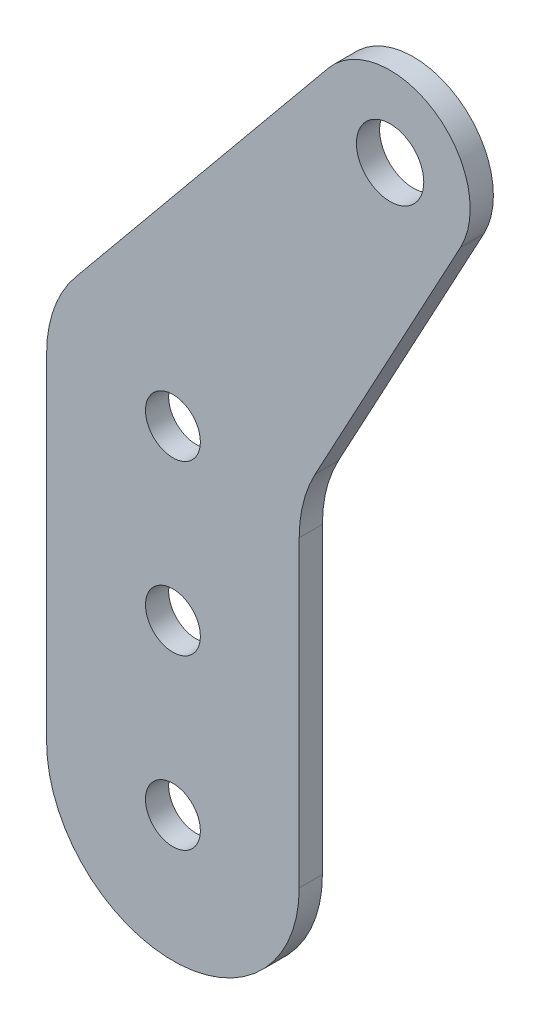
ISO-10303-21;
HEADER;
FILE_DESCRIPTION(('STEP AP214'),'2;1');
FILE_NAME('part.step','',(''),(''),'','','');
FILE_SCHEMA(('AUTOMOTIVE_DESIGN { 1 0 10303 214 1 1 1 1 }'));
ENDSEC;
DATA;
#1=APPLICATION_CONTEXT('core data for automotive mechanical design processes');
#2=APPLICATION_PROTOCOL_DEFINITION('international standard','automotive_design',2000,#1);
#3=PRODUCT_CONTEXT('',#1,'mechanical');
#4=PRODUCT('Part','Part','',(#3));
#5=PRODUCT_RELATED_PRODUCT_CATEGORY('part','',(#4));
#6=PRODUCT_DEFINITION_FORMATION('','',#4);
#7=PRODUCT_DEFINITION_CONTEXT('part definition',#1,'design');
#8=PRODUCT_DEFINITION('design','',#6,#7);
#9=PRODUCT_DEFINITION_SHAPE('','',#8);
#10=(LENGTH_UNIT() NAMED_UNIT(*) SI_UNIT(.MILLI.,.METRE.));
#11=(NAMED_UNIT(*) PLANE_ANGLE_UNIT() SI_UNIT($,.RADIAN.));
#12=(NAMED_UNIT(*) SI_UNIT($,.STERADIAN.) SOLID_ANGLE_UNIT());
#13=UNCERTAINTY_MEASURE_WITH_UNIT(LENGTH_MEASURE(1.E-05),#10,'distance_accuracy_value','');
#14=(GEOMETRIC_REPRESENTATION_CONTEXT(3) GLOBAL_UNCERTAINTY_ASSIGNED_CONTEXT((#13)) GLOBAL_UNIT_ASSIGNED_CONTEXT((#10,
#11,#12)) REPRESENTATION_CONTEXT('',''));
#15=CARTESIAN_POINT('',(0.,0.,0.));
#16=DIRECTION('',(0.,0.,1.));
#17=DIRECTION('',(1.,0.,0.));
#18=AXIS2_PLACEMENT_3D('',#15,#16,#17);
#19=CARTESIAN_POINT('',(16.38,50.8,0.875));
#20=DIRECTION('',(0.,0.,-1.));
#21=DIRECTION('',(-1.,0.,0.));
#22=AXIS2_PLACEMENT_3D('',#19,#20,#21);
#23=CYLINDRICAL_SURFACE('',#22,6.04);
#24=CARTESIAN_POINT('',(16.38,50.8,-0.875));
#25=DIRECTION('',(0.,0.,1.));
#26=DIRECTION('',(1.,0.,0.));
#27=AXIS2_PLACEMENT_3D('',#24,#25,#26);
#28=CIRCLE('',#27,6.04);
#29=CARTESIAN_POINT('',(21.6942958006757,47.929484341983,-0.875));
#30=VERTEX_POINT('',#29);
#31=CARTESIAN_POINT('',(11.7152723593544,54.636914911566,-0.875));
#32=VERTEX_POINT('',#31);
#33=EDGE_CURVE('E125',#30,#32,#28,.T.);
#34=ORIENTED_EDGE('',*,*,#33,.T.);
#35=DIRECTION('',(0.,0.,-1.));
#36=VECTOR('',#35,1.);
#37=CARTESIAN_POINT('',(11.7152723593544,54.636914911566,0.875));
#38=LINE('',#37,#36);
#39=CARTESIAN_POINT('',(11.7152723593544,54.636914911566,0.875));
#40=VERTEX_POINT('',#39);
#41=EDGE_CURVE('E123',#40,#32,#38,.T.);
#42=ORIENTED_EDGE('',*,*,#41,.F.);
#43=CARTESIAN_POINT('',(16.38,50.8,0.875));
#44=DIRECTION('',(0.,0.,1.));
#45=DIRECTION('',(1.,0.,0.));
#46=AXIS2_PLACEMENT_3D('',#43,#44,#45);
#47=CIRCLE('',#46,6.04);
#48=CARTESIAN_POINT('',(21.6942958006757,47.929484341983,0.875));
#49=VERTEX_POINT('',#48);
#50=EDGE_CURVE('E108',#49,#40,#47,.T.);
#51=ORIENTED_EDGE('',*,*,#50,.F.);
#52=DIRECTION('',(0.,0.,-1.));
#53=VECTOR('',#52,1.);
#54=CARTESIAN_POINT('',(21.6942958006757,47.929484341983,0.875));
#55=LINE('',#54,#53);
#56=EDGE_CURVE('E182',#49,#30,#55,.T.);
#57=ORIENTED_EDGE('',*,*,#56,.T.);
#58=EDGE_LOOP('',(#34,#42,#51,#57));
#59=FACE_BOUND('',#58,.T.);
#60=ADVANCED_FACE('F44',(#59),#23,.T.);
#61=CARTESIAN_POINT('',(-19.8176556724697,16.3007713246587,0.875));
#62=DIRECTION('',(-0.772305900769136,0.63525081317317,0.));
#63=DIRECTION('',(-0.63525081317317,-0.772305900769136,0.));
#64=AXIS2_PLACEMENT_3D('',#61,#62,#63);
#65=PLANE('',#64);
#66=DIRECTION('',(0.63525081317317,0.772305900769136,0.));
#67=VECTOR('',#66,1.);
#68=CARTESIAN_POINT('',(-19.8176556724697,16.3007713246587,-0.875));
#69=LINE('',#68,#67);
#70=CARTESIAN_POINT('',(-7.35621370482611,31.4507639954744,-0.875));
#71=VERTEX_POINT('',#70);
#72=EDGE_CURVE('E187',#71,#32,#69,.T.);
#73=ORIENTED_EDGE('',*,*,#72,.F.);
#74=DIRECTION('',(0.,0.,-1.));
#75=VECTOR('',#74,1.);
#76=CARTESIAN_POINT('',(-7.35621370482611,31.4507639954744,0.875));
#77=LINE('',#76,#75);
#78=CARTESIAN_POINT('',(-7.35621370482611,31.4507639954744,0.875));
#79=VERTEX_POINT('',#78);
#80=EDGE_CURVE('E130',#79,#71,#77,.T.);
#81=ORIENTED_EDGE('',*,*,#80,.F.);
#82=DIRECTION('',(0.63525081317317,0.772305900769136,0.));
#83=VECTOR('',#82,1.);
#84=CARTESIAN_POINT('',(-19.8176556724697,16.3007713246587,0.875));
#85=LINE('',#84,#83);
#86=EDGE_CURVE('E113',#79,#40,#85,.T.);
#87=ORIENTED_EDGE('',*,*,#86,.T.);
#88=ORIENTED_EDGE('',*,*,#41,.T.);
#89=EDGE_LOOP('',(#73,#81,#87,#88));
#90=FACE_BOUND('',#89,.T.);
#91=ADVANCED_FACE('F132',(#90),#65,.T.);
#92=CARTESIAN_POINT('',(0.,25.4,0.875));
#93=DIRECTION('',(0.,0.,-1.));
#94=DIRECTION('',(-1.,0.,0.));
#95=AXIS2_PLACEMENT_3D('',#92,#93,#94);
#96=CYLINDRICAL_SURFACE('',#95,9.525);
#97=CARTESIAN_POINT('',(0.,25.4,-0.875));
#98=DIRECTION('',(0.,0.,1.));
#99=DIRECTION('',(1.,0.,0.));
#100=AXIS2_PLACEMENT_3D('',#97,#98,#99);
#101=CIRCLE('',#100,9.525);
#102=CARTESIAN_POINT('',(-9.52500000000009,25.4,-0.875));
#103=VERTEX_POINT('',#102);
#104=EDGE_CURVE('E189',#71,#103,#101,.T.);
#105=ORIENTED_EDGE('',*,*,#104,.T.);
#106=DIRECTION('',(0.,0.,-1.));
#107=VECTOR('',#106,1.);
#108=CARTESIAN_POINT('',(-9.52500000000009,25.4,0.875));
#109=LINE('',#108,#107);
#110=CARTESIAN_POINT('',(-9.52500000000009,25.4,0.875));
#111=VERTEX_POINT('',#110);
#112=EDGE_CURVE('E216',#111,#103,#109,.T.);
#113=ORIENTED_EDGE('',*,*,#112,.F.);
#114=CARTESIAN_POINT('',(0.,25.4,0.875));
#115=DIRECTION('',(0.,0.,1.));
#116=DIRECTION('',(1.,0.,0.));
#117=AXIS2_PLACEMENT_3D('',#114,#115,#116);
#118=CIRCLE('',#117,9.525);
#119=EDGE_CURVE('E135',#79,#111,#118,.T.);
#120=ORIENTED_EDGE('',*,*,#119,.F.);
#121=ORIENTED_EDGE('',*,*,#80,.T.);
#122=EDGE_LOOP('',(#105,#113,#120,#121));
#123=FACE_BOUND('',#122,.T.);
#124=ADVANCED_FACE('F234',(#123),#96,.T.);
#125=CARTESIAN_POINT('',(-9.525,0.,0.875));
#126=DIRECTION('',(1.,0.,0.));
#127=DIRECTION('',(0.,1.,0.));
#128=AXIS2_PLACEMENT_3D('',#125,#126,#127);
#129=PLANE('',#128);
#130=DIRECTION('',(0.,-1.,0.));
#131=VECTOR('',#130,1.);
#132=CARTESIAN_POINT('',(-9.525,0.,-0.875));
#133=LINE('',#132,#131);
#134=CARTESIAN_POINT('',(-9.525,0.,-0.875));
#135=VERTEX_POINT('',#134);
#136=EDGE_CURVE('E191',#103,#135,#133,.T.);
#137=ORIENTED_EDGE('',*,*,#136,.T.);
#138=DIRECTION('',(0.,0.,-1.));
#139=VECTOR('',#138,1.);
#140=CARTESIAN_POINT('',(-9.525,0.,0.875));
#141=LINE('',#140,#139);
#142=CARTESIAN_POINT('',(-9.525,0.,0.875));
#143=VERTEX_POINT('',#142);
#144=EDGE_CURVE('E213',#143,#135,#141,.T.);
#145=ORIENTED_EDGE('',*,*,#144,.F.);
#146=DIRECTION('',(0.,-1.,0.));
#147=VECTOR('',#146,1.);
#148=CARTESIAN_POINT('',(-9.525,0.,0.875));
#149=LINE('',#148,#147);
#150=EDGE_CURVE('E138',#111,#143,#149,.T.);
#151=ORIENTED_EDGE('',*,*,#150,.F.);
#152=ORIENTED_EDGE('',*,*,#112,.T.);
#153=EDGE_LOOP('',(#137,#145,#151,#152));
#154=FACE_BOUND('',#153,.T.);
#155=ADVANCED_FACE('F237',(#154),#129,.F.);
#156=CARTESIAN_POINT('',(0.,0.,0.875));
#157=DIRECTION('',(0.,0.,-1.));
#158=DIRECTION('',(-1.,0.,0.));
#159=AXIS2_PLACEMENT_3D('',#156,#157,#158);
#160=CYLINDRICAL_SURFACE('',#159,9.525);
#161=CARTESIAN_POINT('',(0.,0.,-0.875));
#162=DIRECTION('',(0.,0.,1.));
#163=DIRECTION('',(1.,0.,0.));
#164=AXIS2_PLACEMENT_3D('',#161,#162,#163);
#165=CIRCLE('',#164,9.525);
#166=CARTESIAN_POINT('',(9.525,0.,-0.875));
#167=VERTEX_POINT('',#166);
#168=EDGE_CURVE('E193',#135,#167,#165,.T.);
#169=ORIENTED_EDGE('',*,*,#168,.T.);
#170=DIRECTION('',(0.,0.,-1.));
#171=VECTOR('',#170,1.);
#172=CARTESIAN_POINT('',(9.525,0.,0.875));
#173=LINE('',#172,#171);
#174=CARTESIAN_POINT('',(9.525,0.,0.875));
#175=VERTEX_POINT('',#174);
#176=EDGE_CURVE('E210',#175,#167,#173,.T.);
#177=ORIENTED_EDGE('',*,*,#176,.F.);
#178=CARTESIAN_POINT('',(0.,0.,0.875));
#179=DIRECTION('',(0.,0.,1.));
#180=DIRECTION('',(1.,0.,0.));
#181=AXIS2_PLACEMENT_3D('',#178,#179,#180);
#182=CIRCLE('',#181,9.525);
#183=EDGE_CURVE('E155',#143,#175,#182,.T.);
#184=ORIENTED_EDGE('',*,*,#183,.F.);
#185=ORIENTED_EDGE('',*,*,#144,.T.);
#186=EDGE_LOOP('',(#169,#177,#184,#185));
#187=FACE_BOUND('',#186,.T.);
#188=ADVANCED_FACE('F242',(#187),#160,.T.);
#189=CARTESIAN_POINT('',(9.525,0.,0.875));
#190=DIRECTION('',(1.,0.,0.));
#191=DIRECTION('',(0.,1.,0.));
#192=AXIS2_PLACEMENT_3D('',#189,#190,#191);
#193=PLANE('',#192);
#194=DIRECTION('',(0.,-1.,0.));
#195=VECTOR('',#194,1.);
#196=CARTESIAN_POINT('',(9.525,0.,-0.875));
#197=LINE('',#196,#195);
#198=CARTESIAN_POINT('',(9.52499999999992,22.8718681735892,-0.875));
#199=VERTEX_POINT('',#198);
#200=EDGE_CURVE('E196',#199,#167,#197,.T.);
#201=ORIENTED_EDGE('',*,*,#200,.F.);
#202=DIRECTION('',(0.,0.,-1.));
#203=VECTOR('',#202,1.);
#204=CARTESIAN_POINT('',(9.52499999999992,22.8718681735892,0.875));
#205=LINE('',#204,#203);
#206=CARTESIAN_POINT('',(9.52499999999992,22.8718681735892,0.875));
#207=VERTEX_POINT('',#206);
#208=EDGE_CURVE('E60',#199,#207,#205,.F.);
#209=ORIENTED_EDGE('',*,*,#208,.T.);
#210=DIRECTION('',(0.,-1.,0.));
#211=VECTOR('',#210,1.);
#212=CARTESIAN_POINT('',(9.525,0.,0.875));
#213=LINE('',#212,#211);
#214=EDGE_CURVE('E160',#207,#175,#213,.T.);
#215=ORIENTED_EDGE('',*,*,#214,.T.);
#216=ORIENTED_EDGE('',*,*,#176,.T.);
#217=EDGE_LOOP('',(#201,#209,#215,#216));
#218=FACE_BOUND('',#217,.T.);
#219=ADVANCED_FACE('F243',(#218),#193,.T.);
#220=CARTESIAN_POINT('',(0.,12.7,0.875));
#221=DIRECTION('',(0.,0.,-1.));
#222=DIRECTION('',(-1.,0.,0.));
#223=AXIS2_PLACEMENT_3D('',#220,#221,#222);
#224=CYLINDRICAL_SURFACE('',#223,2.07);
#225=CARTESIAN_POINT('',(0.,12.7,0.875));
#226=DIRECTION('',(0.,0.,1.));
#227=DIRECTION('',(1.,0.,0.));
#228=AXIS2_PLACEMENT_3D('',#225,#226,#227);
#229=CIRCLE('',#228,2.07);
#230=CARTESIAN_POINT('',(2.06999999999996,12.7,0.875));
#231=VERTEX_POINT('',#230);
#232=EDGE_CURVE('E173',#231,#231,#229,.T.);
#233=ORIENTED_EDGE('',*,*,#232,.T.);
#234=EDGE_LOOP('',(#233));
#235=FACE_BOUND('',#234,.T.);
#236=CARTESIAN_POINT('',(0.,12.7,-0.875));
#237=DIRECTION('',(0.,0.,1.));
#238=DIRECTION('',(1.,0.,0.));
#239=AXIS2_PLACEMENT_3D('',#236,#237,#238);
#240=CIRCLE('',#239,2.07);
#241=CARTESIAN_POINT('',(2.06999999999996,12.7,-0.875));
#242=VERTEX_POINT('',#241);
#243=EDGE_CURVE('E203',#242,#242,#240,.T.);
#244=ORIENTED_EDGE('',*,*,#243,.F.);
#245=EDGE_LOOP('',(#244));
#246=FACE_BOUND('',#245,.T.);
#247=ADVANCED_FACE('F281',(#235,#246),#224,.F.);
#248=CARTESIAN_POINT('',(0.,25.4,0.875));
#249=DIRECTION('',(0.,0.,-1.));
#250=DIRECTION('',(-1.,0.,0.));
#251=AXIS2_PLACEMENT_3D('',#248,#249,#250);
#252=CYLINDRICAL_SURFACE('',#251,2.07);
#253=CARTESIAN_POINT('',(0.,25.4,0.875));
#254=DIRECTION('',(0.,0.,1.));
#255=DIRECTION('',(1.,0.,0.));
#256=AXIS2_PLACEMENT_3D('',#253,#254,#255);
#257=CIRCLE('',#256,2.07);
#258=CARTESIAN_POINT('',(2.06999999999991,25.4,0.875));
#259=VERTEX_POINT('',#258);
#260=EDGE_CURVE('E169',#259,#259,#257,.T.);
#261=ORIENTED_EDGE('',*,*,#260,.T.);
#262=EDGE_LOOP('',(#261));
#263=FACE_BOUND('',#262,.T.);
#264=CARTESIAN_POINT('',(0.,25.4,-0.875));
#265=DIRECTION('',(0.,0.,1.));
#266=DIRECTION('',(1.,0.,0.));
#267=AXIS2_PLACEMENT_3D('',#264,#265,#266);
#268=CIRCLE('',#267,2.07);
#269=CARTESIAN_POINT('',(2.06999999999991,25.4,-0.875));
#270=VERTEX_POINT('',#269);
#271=EDGE_CURVE('E200',#270,#270,#268,.T.);
#272=ORIENTED_EDGE('',*,*,#271,.F.);
#273=EDGE_LOOP('',(#272));
#274=FACE_BOUND('',#273,.T.);
#275=ADVANCED_FACE('F267',(#263,#274),#252,.F.);
#276=CARTESIAN_POINT('',(-3.24735121988984,1.75405601671425,0.875));
#277=DIRECTION('',(-0.879850298125112,0.475250936757784,0.));
#278=DIRECTION('',(-0.475250936757784,-0.879850298125112,0.));
#279=AXIS2_PLACEMENT_3D('',#276,#277,#278);
#280=PLANE('',#279);
#281=DIRECTION('',(0.475250936757784,0.879850298125112,0.));
#282=VECTOR('',#281,1.);
#283=CARTESIAN_POINT('',(-3.24735121988984,1.75405601671425,0.875));
#284=LINE('',#283,#282);
#285=CARTESIAN_POINT('',(10.7264970187488,27.6243775411671,0.875));
#286=VERTEX_POINT('',#285);
#287=EDGE_CURVE('E115',#286,#49,#284,.T.);
#288=ORIENTED_EDGE('',*,*,#287,.F.);
#289=DIRECTION('',(0.,0.,-1.));
#290=VECTOR('',#289,1.);
#291=CARTESIAN_POINT('',(10.7264970187488,27.6243775411671,0.875));
#292=LINE('',#291,#290);
#293=CARTESIAN_POINT('',(10.7264970187488,27.6243775411671,-0.875));
#294=VERTEX_POINT('',#293);
#295=EDGE_CURVE('E129',#286,#294,#292,.T.);
#296=ORIENTED_EDGE('',*,*,#295,.T.);
#297=DIRECTION('',(0.475250936757784,0.879850298125112,0.));
#298=VECTOR('',#297,1.);
#299=CARTESIAN_POINT('',(-3.24735121988984,1.75405601671425,-0.875));
#300=LINE('',#299,#298);
#301=EDGE_CURVE('E198',#294,#30,#300,.T.);
#302=ORIENTED_EDGE('',*,*,#301,.T.);
#303=ORIENTED_EDGE('',*,*,#56,.F.);
#304=EDGE_LOOP('',(#288,#296,#302,#303));
#305=FACE_BOUND('',#304,.T.);
#306=ADVANCED_FACE('F224',(#305),#280,.F.);
#307=CARTESIAN_POINT('',(16.38,50.8,0.875));
#308=DIRECTION('',(0.,0.,-1.));
#309=DIRECTION('',(-1.,0.,0.));
#310=AXIS2_PLACEMENT_3D('',#307,#308,#309);
#311=CYLINDRICAL_SURFACE('',#310,2.54);
#312=CARTESIAN_POINT('',(16.38,50.8,0.875));
#313=DIRECTION('',(0.,0.,1.));
#314=DIRECTION('',(1.,0.,0.));
#315=AXIS2_PLACEMENT_3D('',#312,#313,#314);
#316=CIRCLE('',#315,2.54);
#317=CARTESIAN_POINT('',(18.92,50.8,0.875));
#318=VERTEX_POINT('',#317);
#319=EDGE_CURVE('E120',#318,#318,#316,.T.);
#320=ORIENTED_EDGE('',*,*,#319,.T.);
#321=EDGE_LOOP('',(#320));
#322=FACE_BOUND('',#321,.T.);
#323=CARTESIAN_POINT('',(16.38,50.8,-0.875));
#324=DIRECTION('',(0.,0.,1.));
#325=DIRECTION('',(1.,0.,0.));
#326=AXIS2_PLACEMENT_3D('',#323,#324,#325);
#327=CIRCLE('',#326,2.54);
#328=CARTESIAN_POINT('',(18.92,50.8,-0.875));
#329=VERTEX_POINT('',#328);
#330=EDGE_CURVE('E183',#329,#329,#327,.T.);
#331=ORIENTED_EDGE('',*,*,#330,.F.);
#332=EDGE_LOOP('',(#331));
#333=FACE_BOUND('',#332,.T.);
#334=ADVANCED_FACE('F257',(#322,#333),#311,.F.);
#335=CARTESIAN_POINT('',(0.,0.,0.875));
#336=DIRECTION('',(0.,0.,-1.));
#337=DIRECTION('',(-1.,0.,0.));
#338=AXIS2_PLACEMENT_3D('',#335,#336,#337);
#339=CYLINDRICAL_SURFACE('',#338,2.07);
#340=CARTESIAN_POINT('',(0.,0.,0.875));
#341=DIRECTION('',(0.,0.,1.));
#342=DIRECTION('',(1.,0.,0.));
#343=AXIS2_PLACEMENT_3D('',#340,#341,#342);
#344=CIRCLE('',#343,2.07);
#345=CARTESIAN_POINT('',(2.07,0.,0.875));
#346=VERTEX_POINT('',#345);
#347=EDGE_CURVE('E177',#346,#346,#344,.T.);
#348=ORIENTED_EDGE('',*,*,#347,.T.);
#349=EDGE_LOOP('',(#348));
#350=FACE_BOUND('',#349,.T.);
#351=CARTESIAN_POINT('',(0.,0.,-0.875));
#352=DIRECTION('',(0.,0.,1.));
#353=DIRECTION('',(1.,0.,0.));
#354=AXIS2_PLACEMENT_3D('',#351,#352,#353);
#355=CIRCLE('',#354,2.07);
#356=CARTESIAN_POINT('',(2.07,0.,-0.875));
#357=VERTEX_POINT('',#356);
#358=EDGE_CURVE('E206',#357,#357,#355,.T.);
#359=ORIENTED_EDGE('',*,*,#358,.F.);
#360=EDGE_LOOP('',(#359));
#361=FACE_BOUND('',#360,.T.);
#362=ADVANCED_FACE('F259',(#350,#361),#339,.F.);
#363=CARTESIAN_POINT('',(0.,0.,0.875));
#364=DIRECTION('',(0.,0.,1.));
#365=DIRECTION('',(1.,0.,0.));
#366=AXIS2_PLACEMENT_3D('',#363,#364,#365);
#367=PLANE('',#366);
#368=ORIENTED_EDGE('',*,*,#319,.F.);
#369=EDGE_LOOP('',(#368));
#370=FACE_BOUND('',#369,.T.);
#371=ORIENTED_EDGE('',*,*,#50,.T.);
#372=ORIENTED_EDGE('',*,*,#86,.F.);
#373=ORIENTED_EDGE('',*,*,#119,.T.);
#374=ORIENTED_EDGE('',*,*,#150,.T.);
#375=ORIENTED_EDGE('',*,*,#183,.T.);
#376=ORIENTED_EDGE('',*,*,#214,.F.);
#377=CARTESIAN_POINT('',(19.5249999999999,22.8718681735893,0.875));
#378=DIRECTION('',(0.,0.,1.));
#379=DIRECTION('',(1.,0.,0.));
#380=AXIS2_PLACEMENT_3D('',#377,#378,#379);
#381=CIRCLE('',#380,10.);
#382=EDGE_CURVE('E12',#207,#286,#381,.F.);
#383=ORIENTED_EDGE('',*,*,#382,.T.);
#384=ORIENTED_EDGE('',*,*,#287,.T.);
#385=EDGE_LOOP('',(#371,#372,#373,#374,#375,#376,#383,#384));
#386=FACE_BOUND('',#385,.T.);
#387=ORIENTED_EDGE('',*,*,#260,.F.);
#388=EDGE_LOOP('',(#387));
#389=FACE_BOUND('',#388,.T.);
#390=ORIENTED_EDGE('',*,*,#232,.F.);
#391=EDGE_LOOP('',(#390));
#392=FACE_BOUND('',#391,.T.);
#393=ORIENTED_EDGE('',*,*,#347,.F.);
#394=EDGE_LOOP('',(#393));
#395=FACE_BOUND('',#394,.T.);
#396=ADVANCED_FACE('F110',(#370,#386,#389,#392,#395),#367,.T.);
#397=CARTESIAN_POINT('',(0.,0.,-0.875));
#398=DIRECTION('',(0.,0.,1.));
#399=DIRECTION('',(1.,0.,0.));
#400=AXIS2_PLACEMENT_3D('',#397,#398,#399);
#401=PLANE('',#400);
#402=ORIENTED_EDGE('',*,*,#330,.T.);
#403=EDGE_LOOP('',(#402));
#404=FACE_BOUND('',#403,.T.);
#405=ORIENTED_EDGE('',*,*,#33,.F.);
#406=ORIENTED_EDGE('',*,*,#301,.F.);
#407=CARTESIAN_POINT('',(19.5249999999999,22.8718681735893,-0.875));
#408=DIRECTION('',(0.,0.,1.));
#409=DIRECTION('',(1.,0.,0.));
#410=AXIS2_PLACEMENT_3D('',#407,#408,#409);
#411=CIRCLE('',#410,10.);
#412=EDGE_CURVE('E53',#294,#199,#411,.T.);
#413=ORIENTED_EDGE('',*,*,#412,.T.);
#414=ORIENTED_EDGE('',*,*,#200,.T.);
#415=ORIENTED_EDGE('',*,*,#168,.F.);
#416=ORIENTED_EDGE('',*,*,#136,.F.);
#417=ORIENTED_EDGE('',*,*,#104,.F.);
#418=ORIENTED_EDGE('',*,*,#72,.T.);
#419=EDGE_LOOP('',(#405,#406,#413,#414,#415,#416,#417,#418));
#420=FACE_BOUND('',#419,.T.);
#421=ORIENTED_EDGE('',*,*,#271,.T.);
#422=EDGE_LOOP('',(#421));
#423=FACE_BOUND('',#422,.T.);
#424=ORIENTED_EDGE('',*,*,#243,.T.);
#425=EDGE_LOOP('',(#424));
#426=FACE_BOUND('',#425,.T.);
#427=ORIENTED_EDGE('',*,*,#358,.T.);
#428=EDGE_LOOP('',(#427));
#429=FACE_BOUND('',#428,.T.);
#430=ADVANCED_FACE('F227',(#404,#420,#423,#426,#429),#401,.F.);
#431=CARTESIAN_POINT('',(19.5249999999999,22.8718681735893,0.875));
#432=DIRECTION('',(0.,0.,-1.));
#433=DIRECTION('',(-1.,0.,0.));
#434=AXIS2_PLACEMENT_3D('',#431,#432,#433);
#435=CYLINDRICAL_SURFACE('',#434,10.);
#436=ORIENTED_EDGE('',*,*,#382,.F.);
#437=ORIENTED_EDGE('',*,*,#208,.F.);
#438=ORIENTED_EDGE('',*,*,#412,.F.);
#439=ORIENTED_EDGE('',*,*,#295,.F.);
#440=EDGE_LOOP('',(#436,#437,#438,#439));
#441=FACE_BOUND('',#440,.T.);
#442=ADVANCED_FACE('F46',(#441),#435,.F.);
#443=CLOSED_SHELL('',(#60,#91,#124,#155,#188,#219,#247,#275,#306,#334,#362,#396,#430,#442));
#444=MANIFOLD_SOLID_BREP('B2',#443);
#445=ADVANCED_BREP_SHAPE_REPRESENTATION('',(#18,#444),#14);
#446=SHAPE_DEFINITION_REPRESENTATION(#9,#445);
ENDSEC;
END-ISO-10303-21;
